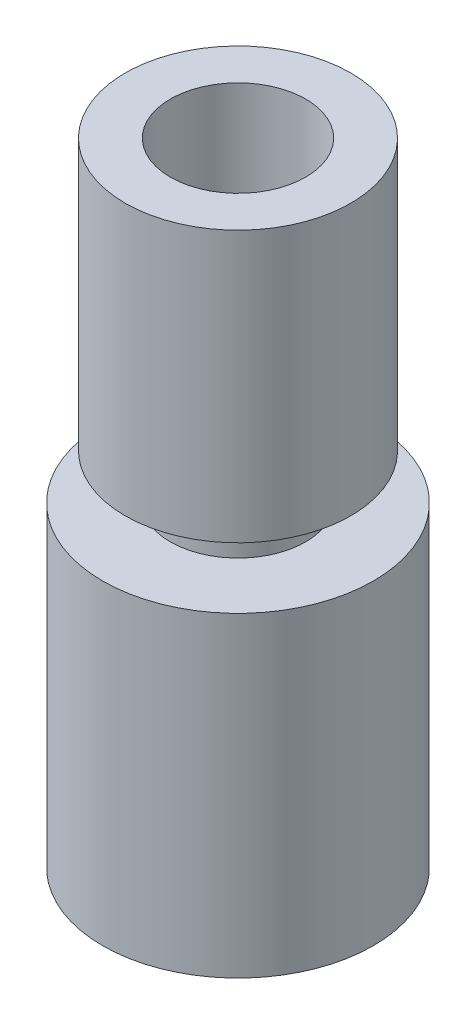
ISO-10303-21;
HEADER;
FILE_DESCRIPTION(('STEP AP214'),'2;1');
FILE_NAME('part.step','',(''),(''),'','','');
FILE_SCHEMA(('AUTOMOTIVE_DESIGN { 1 0 10303 214 1 1 1 1 }'));
ENDSEC;
DATA;
#1=APPLICATION_CONTEXT('core data for automotive mechanical design processes');
#2=APPLICATION_PROTOCOL_DEFINITION('international standard','automotive_design',2000,#1);
#3=PRODUCT_CONTEXT('',#1,'mechanical');
#4=PRODUCT('Part','Part','',(#3));
#5=PRODUCT_RELATED_PRODUCT_CATEGORY('part','',(#4));
#6=PRODUCT_DEFINITION_FORMATION('','',#4);
#7=PRODUCT_DEFINITION_CONTEXT('part definition',#1,'design');
#8=PRODUCT_DEFINITION('design','',#6,#7);
#9=PRODUCT_DEFINITION_SHAPE('','',#8);
#10=(LENGTH_UNIT() NAMED_UNIT(*) SI_UNIT(.MILLI.,.METRE.));
#11=(NAMED_UNIT(*) PLANE_ANGLE_UNIT() SI_UNIT($,.RADIAN.));
#12=(NAMED_UNIT(*) SI_UNIT($,.STERADIAN.) SOLID_ANGLE_UNIT());
#13=UNCERTAINTY_MEASURE_WITH_UNIT(LENGTH_MEASURE(1.E-05),#10,'distance_accuracy_value','');
#14=(GEOMETRIC_REPRESENTATION_CONTEXT(3) GLOBAL_UNCERTAINTY_ASSIGNED_CONTEXT((#13)) GLOBAL_UNIT_ASSIGNED_CONTEXT((#10,
#11,#12)) REPRESENTATION_CONTEXT('',''));
#15=CARTESIAN_POINT('',(0.,0.,0.));
#16=DIRECTION('',(0.,0.,1.));
#17=DIRECTION('',(1.,0.,0.));
#18=AXIS2_PLACEMENT_3D('',#15,#16,#17);
#19=CARTESIAN_POINT('',(-1.5,3.,0.));
#20=DIRECTION('',(0.,-1.,0.));
#21=DIRECTION('',(0.,0.,-1.));
#22=AXIS2_PLACEMENT_3D('',#19,#20,#21);
#23=PLANE('',#22);
#24=CARTESIAN_POINT('',(0.,3.,0.));
#25=DIRECTION('',(0.,1.,0.));
#26=DIRECTION('',(0.,0.,1.));
#27=AXIS2_PLACEMENT_3D('',#24,#25,#26);
#28=CIRCLE('',#27,1.5);
#29=CARTESIAN_POINT('',(0.,3.,1.5));
#30=VERTEX_POINT('',#29);
#31=EDGE_CURVE('E10',#30,#30,#28,.T.);
#32=ORIENTED_EDGE('',*,*,#31,.F.);
#33=EDGE_LOOP('',(#32));
#34=FACE_BOUND('',#33,.T.);
#35=ADVANCED_FACE('F31',(#34),#23,.T.);
#36=CARTESIAN_POINT('',(0.,11.,0.));
#37=DIRECTION('',(0.,1.,0.));
#38=DIRECTION('',(0.,0.,1.));
#39=AXIS2_PLACEMENT_3D('',#36,#37,#38);
#40=CYLINDRICAL_SURFACE('',#39,1.5);
#41=ORIENTED_EDGE('',*,*,#31,.T.);
#42=EDGE_LOOP('',(#41));
#43=FACE_BOUND('',#42,.T.);
#44=CARTESIAN_POINT('',(0.,0.,0.));
#45=DIRECTION('',(0.,1.,0.));
#46=DIRECTION('',(0.,0.,1.));
#47=AXIS2_PLACEMENT_3D('',#44,#45,#46);
#48=CIRCLE('',#47,1.5);
#49=CARTESIAN_POINT('',(0.,0.,1.5));
#50=VERTEX_POINT('',#49);
#51=EDGE_CURVE('E37',#50,#50,#48,.T.);
#52=ORIENTED_EDGE('',*,*,#51,.F.);
#53=EDGE_LOOP('',(#52));
#54=FACE_BOUND('',#53,.T.);
#55=ADVANCED_FACE('F85',(#43,#54),#40,.F.);
#56=CARTESIAN_POINT('',(-3.,0.,0.));
#57=DIRECTION('',(0.,-1.,0.));
#58=DIRECTION('',(0.,0.,-1.));
#59=AXIS2_PLACEMENT_3D('',#56,#57,#58);
#60=PLANE('',#59);
#61=ORIENTED_EDGE('',*,*,#51,.T.);
#62=EDGE_LOOP('',(#61));
#63=FACE_BOUND('',#62,.T.);
#64=CARTESIAN_POINT('',(0.,0.,0.));
#65=DIRECTION('',(0.,1.,0.));
#66=DIRECTION('',(0.,0.,1.));
#67=AXIS2_PLACEMENT_3D('',#64,#65,#66);
#68=CIRCLE('',#67,3.);
#69=CARTESIAN_POINT('',(0.,0.,3.));
#70=VERTEX_POINT('',#69);
#71=EDGE_CURVE('E41',#70,#70,#68,.T.);
#72=ORIENTED_EDGE('',*,*,#71,.F.);
#73=EDGE_LOOP('',(#72));
#74=FACE_BOUND('',#73,.T.);
#75=ADVANCED_FACE('F90',(#63,#74),#60,.T.);
#76=CARTESIAN_POINT('',(0.,11.,0.));
#77=DIRECTION('',(0.,1.,0.));
#78=DIRECTION('',(0.,0.,1.));
#79=AXIS2_PLACEMENT_3D('',#76,#77,#78);
#80=CYLINDRICAL_SURFACE('',#79,3.);
#81=ORIENTED_EDGE('',*,*,#71,.T.);
#82=EDGE_LOOP('',(#81));
#83=FACE_BOUND('',#82,.T.);
#84=CARTESIAN_POINT('',(0.,7.,0.));
#85=DIRECTION('',(0.,1.,0.));
#86=DIRECTION('',(0.,0.,1.));
#87=AXIS2_PLACEMENT_3D('',#84,#85,#86);
#88=CIRCLE('',#87,3.);
#89=CARTESIAN_POINT('',(0.,7.,3.));
#90=VERTEX_POINT('',#89);
#91=EDGE_CURVE('E45',#90,#90,#88,.T.);
#92=ORIENTED_EDGE('',*,*,#91,.F.);
#93=EDGE_LOOP('',(#92));
#94=FACE_BOUND('',#93,.T.);
#95=ADVANCED_FACE('F94',(#83,#94),#80,.T.);
#96=CARTESIAN_POINT('',(-3.,7.,0.));
#97=DIRECTION('',(0.,1.,0.));
#98=DIRECTION('',(0.,0.,1.));
#99=AXIS2_PLACEMENT_3D('',#96,#97,#98);
#100=PLANE('',#99);
#101=ORIENTED_EDGE('',*,*,#91,.T.);
#102=EDGE_LOOP('',(#101));
#103=FACE_BOUND('',#102,.T.);
#104=CARTESIAN_POINT('',(0.,7.,0.));
#105=DIRECTION('',(0.,1.,0.));
#106=DIRECTION('',(0.,0.,1.));
#107=AXIS2_PLACEMENT_3D('',#104,#105,#106);
#108=CIRCLE('',#107,1.5);
#109=CARTESIAN_POINT('',(0.,7.,1.5));
#110=VERTEX_POINT('',#109);
#111=EDGE_CURVE('E50',#110,#110,#108,.T.);
#112=ORIENTED_EDGE('',*,*,#111,.F.);
#113=EDGE_LOOP('',(#112));
#114=FACE_BOUND('',#113,.T.);
#115=ADVANCED_FACE('F100',(#103,#114),#100,.T.);
#116=CARTESIAN_POINT('',(0.,11.,0.));
#117=DIRECTION('',(0.,1.,0.));
#118=DIRECTION('',(0.,0.,1.));
#119=AXIS2_PLACEMENT_3D('',#116,#117,#118);
#120=CYLINDRICAL_SURFACE('',#119,1.5);
#121=ORIENTED_EDGE('',*,*,#111,.T.);
#122=EDGE_LOOP('',(#121));
#123=FACE_BOUND('',#122,.T.);
#124=CARTESIAN_POINT('',(0.,8.,0.));
#125=DIRECTION('',(0.,1.,0.));
#126=DIRECTION('',(0.,0.,1.));
#127=AXIS2_PLACEMENT_3D('',#124,#125,#126);
#128=CIRCLE('',#127,1.5);
#129=CARTESIAN_POINT('',(0.,8.,1.5));
#130=VERTEX_POINT('',#129);
#131=EDGE_CURVE('E53',#130,#130,#128,.T.);
#132=ORIENTED_EDGE('',*,*,#131,.F.);
#133=EDGE_LOOP('',(#132));
#134=FACE_BOUND('',#133,.T.);
#135=ADVANCED_FACE('F104',(#123,#134),#120,.T.);
#136=CARTESIAN_POINT('',(-1.5,8.,0.));
#137=DIRECTION('',(0.,-1.,0.));
#138=DIRECTION('',(0.,0.,-1.));
#139=AXIS2_PLACEMENT_3D('',#136,#137,#138);
#140=PLANE('',#139);
#141=ORIENTED_EDGE('',*,*,#131,.T.);
#142=EDGE_LOOP('',(#141));
#143=FACE_BOUND('',#142,.T.);
#144=CARTESIAN_POINT('',(0.,8.,0.));
#145=DIRECTION('',(0.,1.,0.));
#146=DIRECTION('',(0.,0.,1.));
#147=AXIS2_PLACEMENT_3D('',#144,#145,#146);
#148=CIRCLE('',#147,2.5);
#149=CARTESIAN_POINT('',(0.,8.,2.5));
#150=VERTEX_POINT('',#149);
#151=EDGE_CURVE('E56',#150,#150,#148,.T.);
#152=ORIENTED_EDGE('',*,*,#151,.F.);
#153=EDGE_LOOP('',(#152));
#154=FACE_BOUND('',#153,.T.);
#155=ADVANCED_FACE('F108',(#143,#154),#140,.T.);
#156=CARTESIAN_POINT('',(0.,11.,0.));
#157=DIRECTION('',(0.,1.,0.));
#158=DIRECTION('',(0.,0.,1.));
#159=AXIS2_PLACEMENT_3D('',#156,#157,#158);
#160=CYLINDRICAL_SURFACE('',#159,2.5);
#161=ORIENTED_EDGE('',*,*,#151,.T.);
#162=EDGE_LOOP('',(#161));
#163=FACE_BOUND('',#162,.T.);
#164=CARTESIAN_POINT('',(0.,14.,0.));
#165=DIRECTION('',(0.,1.,0.));
#166=DIRECTION('',(0.,0.,1.));
#167=AXIS2_PLACEMENT_3D('',#164,#165,#166);
#168=CIRCLE('',#167,2.5);
#169=CARTESIAN_POINT('',(0.,14.,2.5));
#170=VERTEX_POINT('',#169);
#171=EDGE_CURVE('E59',#170,#170,#168,.T.);
#172=ORIENTED_EDGE('',*,*,#171,.F.);
#173=EDGE_LOOP('',(#172));
#174=FACE_BOUND('',#173,.T.);
#175=ADVANCED_FACE('F81',(#163,#174),#160,.T.);
#176=CARTESIAN_POINT('',(-2.5,14.,0.));
#177=DIRECTION('',(0.,1.,0.));
#178=DIRECTION('',(0.,0.,1.));
#179=AXIS2_PLACEMENT_3D('',#176,#177,#178);
#180=PLANE('',#179);
#181=ORIENTED_EDGE('',*,*,#171,.T.);
#182=EDGE_LOOP('',(#181));
#183=FACE_BOUND('',#182,.T.);
#184=CARTESIAN_POINT('',(0.,14.,0.));
#185=DIRECTION('',(0.,1.,0.));
#186=DIRECTION('',(0.,0.,1.));
#187=AXIS2_PLACEMENT_3D('',#184,#185,#186);
#188=CIRCLE('',#187,1.5);
#189=CARTESIAN_POINT('',(0.,14.,1.5));
#190=VERTEX_POINT('',#189);
#191=EDGE_CURVE('E62',#190,#190,#188,.T.);
#192=ORIENTED_EDGE('',*,*,#191,.F.);
#193=EDGE_LOOP('',(#192));
#194=FACE_BOUND('',#193,.T.);
#195=ADVANCED_FACE('F73',(#183,#194),#180,.T.);
#196=CARTESIAN_POINT('',(0.,11.,0.));
#197=DIRECTION('',(0.,1.,0.));
#198=DIRECTION('',(0.,0.,1.));
#199=AXIS2_PLACEMENT_3D('',#196,#197,#198);
#200=CYLINDRICAL_SURFACE('',#199,1.5);
#201=ORIENTED_EDGE('',*,*,#191,.T.);
#202=EDGE_LOOP('',(#201));
#203=FACE_BOUND('',#202,.T.);
#204=CARTESIAN_POINT('',(0.,11.,0.));
#205=DIRECTION('',(0.,1.,0.));
#206=DIRECTION('',(0.,0.,1.));
#207=AXIS2_PLACEMENT_3D('',#204,#205,#206);
#208=CIRCLE('',#207,1.5);
#209=CARTESIAN_POINT('',(0.,11.,1.5));
#210=VERTEX_POINT('',#209);
#211=EDGE_CURVE('E65',#210,#210,#208,.T.);
#212=ORIENTED_EDGE('',*,*,#211,.F.);
#213=EDGE_LOOP('',(#212));
#214=FACE_BOUND('',#213,.T.);
#215=ADVANCED_FACE('F71',(#203,#214),#200,.F.);
#216=CARTESIAN_POINT('',(-1.5,11.,0.));
#217=DIRECTION('',(0.,1.,0.));
#218=DIRECTION('',(0.,0.,1.));
#219=AXIS2_PLACEMENT_3D('',#216,#217,#218);
#220=PLANE('',#219);
#221=ORIENTED_EDGE('',*,*,#211,.T.);
#222=EDGE_LOOP('',(#221));
#223=FACE_BOUND('',#222,.T.);
#224=ADVANCED_FACE('F69',(#223),#220,.T.);
#225=CLOSED_SHELL('',(#35,#55,#75,#95,#115,#135,#155,#175,#195,#215,#224));
#226=MANIFOLD_SOLID_BREP('B2',#225);
#227=ADVANCED_BREP_SHAPE_REPRESENTATION('',(#18,#226),#14);
#228=SHAPE_DEFINITION_REPRESENTATION(#9,#227);
ENDSEC;
END-ISO-10303-21;
